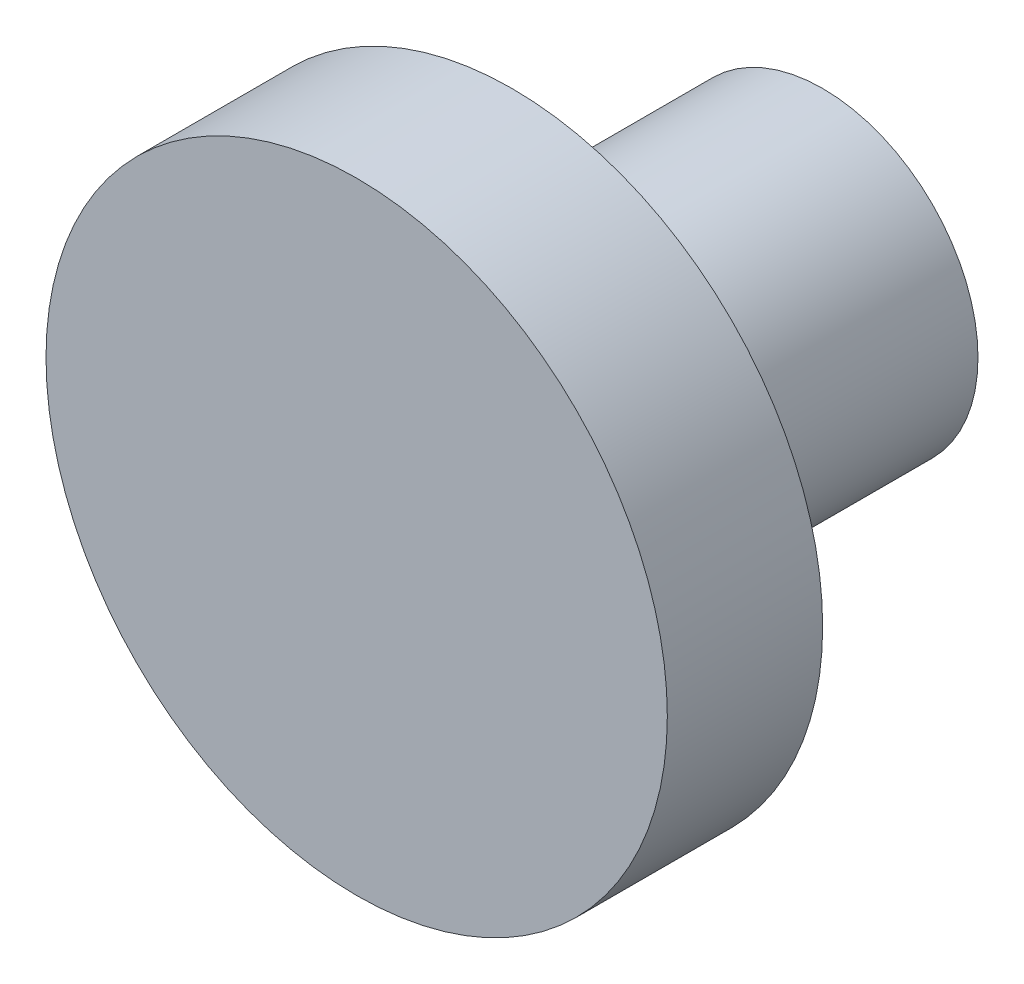
ISO-10303-21;
HEADER;
FILE_DESCRIPTION(('STEP AP214'),'2;1');
FILE_NAME('part.step','',(''),(''),'','','');
FILE_SCHEMA(('AUTOMOTIVE_DESIGN { 1 0 10303 214 1 1 1 1 }'));
ENDSEC;
DATA;
#1=APPLICATION_CONTEXT('core data for automotive mechanical design processes');
#2=APPLICATION_PROTOCOL_DEFINITION('international standard','automotive_design',2000,#1);
#3=PRODUCT_CONTEXT('',#1,'mechanical');
#4=PRODUCT('Part','Part','',(#3));
#5=PRODUCT_RELATED_PRODUCT_CATEGORY('part','',(#4));
#6=PRODUCT_DEFINITION_FORMATION('','',#4);
#7=PRODUCT_DEFINITION_CONTEXT('part definition',#1,'design');
#8=PRODUCT_DEFINITION('design','',#6,#7);
#9=PRODUCT_DEFINITION_SHAPE('','',#8);
#10=(LENGTH_UNIT() NAMED_UNIT(*) SI_UNIT(.MILLI.,.METRE.));
#11=(NAMED_UNIT(*) PLANE_ANGLE_UNIT() SI_UNIT($,.RADIAN.));
#12=(NAMED_UNIT(*) SI_UNIT($,.STERADIAN.) SOLID_ANGLE_UNIT());
#13=UNCERTAINTY_MEASURE_WITH_UNIT(LENGTH_MEASURE(1.E-05),#10,'distance_accuracy_value','');
#14=(GEOMETRIC_REPRESENTATION_CONTEXT(3) GLOBAL_UNCERTAINTY_ASSIGNED_CONTEXT((#13)) GLOBAL_UNIT_ASSIGNED_CONTEXT((#10,
#11,#12)) REPRESENTATION_CONTEXT('',''));
#15=CARTESIAN_POINT('',(0.,0.,0.));
#16=DIRECTION('',(0.,0.,1.));
#17=DIRECTION('',(1.,0.,0.));
#18=AXIS2_PLACEMENT_3D('',#15,#16,#17);
#19=CARTESIAN_POINT('',(0.,0.,10.));
#20=DIRECTION('',(0.,0.,-1.));
#21=DIRECTION('',(-1.,0.,0.));
#22=AXIS2_PLACEMENT_3D('',#19,#20,#21);
#23=CYLINDRICAL_SURFACE('',#22,20.);
#24=CARTESIAN_POINT('',(0.,0.,10.));
#25=DIRECTION('',(0.,0.,1.));
#26=DIRECTION('',(1.,0.,0.));
#27=AXIS2_PLACEMENT_3D('',#24,#25,#26);
#28=CIRCLE('',#27,20.);
#29=CARTESIAN_POINT('',(20.,0.,10.));
#30=VERTEX_POINT('',#29);
#31=EDGE_CURVE('E37',#30,#30,#28,.T.);
#32=ORIENTED_EDGE('',*,*,#31,.F.);
#33=EDGE_LOOP('',(#32));
#34=FACE_BOUND('',#33,.T.);
#35=CARTESIAN_POINT('',(0.,0.,0.));
#36=DIRECTION('',(0.,0.,1.));
#37=DIRECTION('',(1.,0.,0.));
#38=AXIS2_PLACEMENT_3D('',#35,#36,#37);
#39=CIRCLE('',#38,20.);
#40=CARTESIAN_POINT('',(20.,0.,0.));
#41=VERTEX_POINT('',#40);
#42=EDGE_CURVE('E41',#41,#41,#39,.T.);
#43=ORIENTED_EDGE('',*,*,#42,.T.);
#44=EDGE_LOOP('',(#43));
#45=FACE_BOUND('',#44,.T.);
#46=ADVANCED_FACE('F31',(#34,#45),#23,.T.);
#47=CARTESIAN_POINT('',(0.,0.,10.));
#48=DIRECTION('',(0.,0.,1.));
#49=DIRECTION('',(1.,0.,0.));
#50=AXIS2_PLACEMENT_3D('',#47,#48,#49);
#51=PLANE('',#50);
#52=ORIENTED_EDGE('',*,*,#31,.T.);
#53=EDGE_LOOP('',(#52));
#54=FACE_BOUND('',#53,.T.);
#55=ADVANCED_FACE('F62',(#54),#51,.T.);
#56=CARTESIAN_POINT('',(0.,0.,0.));
#57=DIRECTION('',(0.,0.,1.));
#58=DIRECTION('',(1.,0.,0.));
#59=AXIS2_PLACEMENT_3D('',#56,#57,#58);
#60=PLANE('',#59);
#61=CARTESIAN_POINT('',(0.,0.,0.));
#62=DIRECTION('',(0.,0.,1.));
#63=DIRECTION('',(1.,0.,0.));
#64=AXIS2_PLACEMENT_3D('',#61,#62,#63);
#65=CIRCLE('',#64,10.);
#66=CARTESIAN_POINT('',(10.,0.,0.));
#67=VERTEX_POINT('',#66);
#68=EDGE_CURVE('E10',#67,#67,#65,.F.);
#69=ORIENTED_EDGE('',*,*,#68,.F.);
#70=EDGE_LOOP('',(#69));
#71=FACE_BOUND('',#70,.T.);
#72=ORIENTED_EDGE('',*,*,#42,.F.);
#73=EDGE_LOOP('',(#72));
#74=FACE_BOUND('',#73,.T.);
#75=ADVANCED_FACE('F55',(#71,#74),#60,.F.);
#76=CARTESIAN_POINT('',(0.,0.,-20.));
#77=DIRECTION('',(0.,0.,1.));
#78=DIRECTION('',(1.,0.,0.));
#79=AXIS2_PLACEMENT_3D('',#76,#77,#78);
#80=CYLINDRICAL_SURFACE('',#79,10.);
#81=CARTESIAN_POINT('',(0.,0.,-20.));
#82=DIRECTION('',(0.,0.,-1.));
#83=DIRECTION('',(-1.,0.,0.));
#84=AXIS2_PLACEMENT_3D('',#81,#82,#83);
#85=CIRCLE('',#84,10.);
#86=CARTESIAN_POINT('',(-10.,0.,-20.));
#87=VERTEX_POINT('',#86);
#88=EDGE_CURVE('E46',#87,#87,#85,.T.);
#89=ORIENTED_EDGE('',*,*,#88,.F.);
#90=EDGE_LOOP('',(#89));
#91=FACE_BOUND('',#90,.T.);
#92=ORIENTED_EDGE('',*,*,#68,.T.);
#93=EDGE_LOOP('',(#92));
#94=FACE_BOUND('',#93,.T.);
#95=ADVANCED_FACE('F53',(#91,#94),#80,.T.);
#96=CARTESIAN_POINT('',(0.,0.,-20.));
#97=DIRECTION('',(0.,0.,-1.));
#98=DIRECTION('',(-1.,0.,0.));
#99=AXIS2_PLACEMENT_3D('',#96,#97,#98);
#100=PLANE('',#99);
#101=ORIENTED_EDGE('',*,*,#88,.T.);
#102=EDGE_LOOP('',(#101));
#103=FACE_BOUND('',#102,.T.);
#104=ADVANCED_FACE('F51',(#103),#100,.T.);
#105=CLOSED_SHELL('',(#46,#55,#75,#95,#104));
#106=MANIFOLD_SOLID_BREP('B2',#105);
#107=ADVANCED_BREP_SHAPE_REPRESENTATION('',(#18,#106),#14);
#108=SHAPE_DEFINITION_REPRESENTATION(#9,#107);
ENDSEC;
END-ISO-10303-21;
